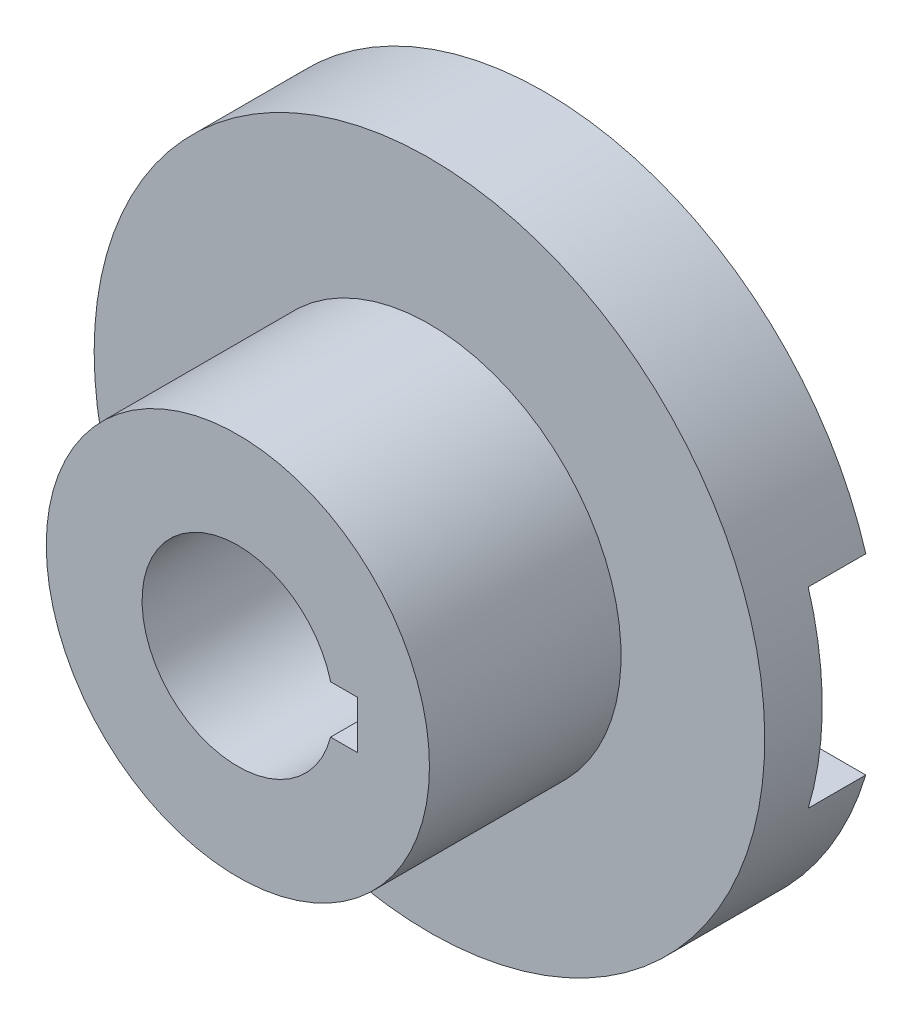
ISO-10303-21;
HEADER;
FILE_DESCRIPTION(('STEP AP214'),'2;1');
FILE_NAME('part.step','',(''),(''),'','','');
FILE_SCHEMA(('AUTOMOTIVE_DESIGN { 1 0 10303 214 1 1 1 1 }'));
ENDSEC;
DATA;
#1=APPLICATION_CONTEXT('core data for automotive mechanical design processes');
#2=APPLICATION_PROTOCOL_DEFINITION('international standard','automotive_design',2000,#1);
#3=PRODUCT_CONTEXT('',#1,'mechanical');
#4=PRODUCT('Part','Part','',(#3));
#5=PRODUCT_RELATED_PRODUCT_CATEGORY('part','',(#4));
#6=PRODUCT_DEFINITION_FORMATION('','',#4);
#7=PRODUCT_DEFINITION_CONTEXT('part definition',#1,'design');
#8=PRODUCT_DEFINITION('design','',#6,#7);
#9=PRODUCT_DEFINITION_SHAPE('','',#8);
#10=(LENGTH_UNIT() NAMED_UNIT(*) SI_UNIT(.MILLI.,.METRE.));
#11=(NAMED_UNIT(*) PLANE_ANGLE_UNIT() SI_UNIT($,.RADIAN.));
#12=(NAMED_UNIT(*) SI_UNIT($,.STERADIAN.) SOLID_ANGLE_UNIT());
#13=UNCERTAINTY_MEASURE_WITH_UNIT(LENGTH_MEASURE(1.E-05),#10,'distance_accuracy_value','');
#14=(GEOMETRIC_REPRESENTATION_CONTEXT(3) GLOBAL_UNCERTAINTY_ASSIGNED_CONTEXT((#13)) GLOBAL_UNIT_ASSIGNED_CONTEXT((#10,
#11,#12)) REPRESENTATION_CONTEXT('',''));
#15=CARTESIAN_POINT('',(0.,0.,0.));
#16=DIRECTION('',(0.,0.,1.));
#17=DIRECTION('',(1.,0.,0.));
#18=AXIS2_PLACEMENT_3D('',#15,#16,#17);
#19=CARTESIAN_POINT('',(0.,0.,5.));
#20=DIRECTION('',(0.,0.,-1.));
#21=DIRECTION('',(-1.,0.,0.));
#22=AXIS2_PLACEMENT_3D('',#19,#20,#21);
#23=CYLINDRICAL_SURFACE('',#22,5.);
#24=CARTESIAN_POINT('',(0.,0.,-8.));
#25=DIRECTION('',(0.,0.,-1.));
#26=DIRECTION('',(-1.,0.,0.));
#27=AXIS2_PLACEMENT_3D('',#24,#25,#26);
#28=CIRCLE('',#27,5.);
#29=CARTESIAN_POINT('',(0.,-5.,-8.));
#30=VERTEX_POINT('',#29);
#31=CARTESIAN_POINT('',(0.,5.,-8.));
#32=VERTEX_POINT('',#31);
#33=EDGE_CURVE('E152',#30,#32,#28,.T.);
#34=ORIENTED_EDGE('',*,*,#33,.T.);
#35=EDGE_CURVE('E162',#32,#30,#28,.T.);
#36=ORIENTED_EDGE('',*,*,#35,.T.);
#37=EDGE_LOOP('',(#34,#36));
#38=FACE_BOUND('',#37,.T.);
#39=CARTESIAN_POINT('',(0.,0.,-5.));
#40=DIRECTION('',(0.,0.,-1.));
#41=DIRECTION('',(-1.,0.,0.));
#42=AXIS2_PLACEMENT_3D('',#39,#40,#41);
#43=CIRCLE('',#42,5.);
#44=CARTESIAN_POINT('',(4.84122918275927,1.25,-5.));
#45=VERTEX_POINT('',#44);
#46=CARTESIAN_POINT('',(4.84122918275927,-1.25,-5.));
#47=VERTEX_POINT('',#46);
#48=EDGE_CURVE('E11',#45,#47,#43,.T.);
#49=ORIENTED_EDGE('',*,*,#48,.F.);
#50=DIRECTION('',(0.,0.,-1.));
#51=VECTOR('',#50,1.);
#52=CARTESIAN_POINT('',(4.84122918275927,1.25,5.));
#53=LINE('',#52,#51);
#54=CARTESIAN_POINT('',(4.84122918275927,1.25,5.));
#55=VERTEX_POINT('',#54);
#56=EDGE_CURVE('E111',#45,#55,#53,.F.);
#57=ORIENTED_EDGE('',*,*,#56,.T.);
#58=CARTESIAN_POINT('',(0.,0.,5.));
#59=DIRECTION('',(0.,0.,1.));
#60=DIRECTION('',(1.,0.,0.));
#61=AXIS2_PLACEMENT_3D('',#58,#59,#60);
#62=CIRCLE('',#61,5.);
#63=CARTESIAN_POINT('',(4.84122918275927,-1.25,5.));
#64=VERTEX_POINT('',#63);
#65=EDGE_CURVE('E173',#55,#64,#62,.T.);
#66=ORIENTED_EDGE('',*,*,#65,.T.);
#67=DIRECTION('',(0.,0.,-1.));
#68=VECTOR('',#67,1.);
#69=CARTESIAN_POINT('',(4.84122918275927,-1.25,5.));
#70=LINE('',#69,#68);
#71=EDGE_CURVE('E48',#47,#64,#70,.F.);
#72=ORIENTED_EDGE('',*,*,#71,.F.);
#73=EDGE_LOOP('',(#49,#57,#66,#72));
#74=FACE_BOUND('',#73,.T.);
#75=ADVANCED_FACE('F33',(#38,#74),#23,.F.);
#76=CARTESIAN_POINT('',(0.,0.,5.));
#77=DIRECTION('',(0.,0.,1.));
#78=DIRECTION('',(1.,0.,0.));
#79=AXIS2_PLACEMENT_3D('',#76,#77,#78);
#80=PLANE('',#79);
#81=CARTESIAN_POINT('',(0.,0.,5.));
#82=DIRECTION('',(0.,0.,1.));
#83=DIRECTION('',(1.,0.,0.));
#84=AXIS2_PLACEMENT_3D('',#81,#82,#83);
#85=CIRCLE('',#84,10.);
#86=CARTESIAN_POINT('',(10.,0.,5.));
#87=VERTEX_POINT('',#86);
#88=EDGE_CURVE('E176',#87,#87,#85,.T.);
#89=ORIENTED_EDGE('',*,*,#88,.T.);
#90=EDGE_LOOP('',(#89));
#91=FACE_BOUND('',#90,.T.);
#92=ORIENTED_EDGE('',*,*,#65,.F.);
#93=DIRECTION('',(1.,0.,0.));
#94=VECTOR('',#93,1.);
#95=CARTESIAN_POINT('',(0.,1.25,5.));
#96=LINE('',#95,#94);
#97=CARTESIAN_POINT('',(6.25,1.25,5.));
#98=VERTEX_POINT('',#97);
#99=EDGE_CURVE('E41',#55,#98,#96,.T.);
#100=ORIENTED_EDGE('',*,*,#99,.T.);
#101=DIRECTION('',(0.,-1.,0.));
#102=VECTOR('',#101,1.);
#103=CARTESIAN_POINT('',(6.25,1.25,5.));
#104=LINE('',#103,#102);
#105=CARTESIAN_POINT('',(6.25,-1.25,5.));
#106=VERTEX_POINT('',#105);
#107=EDGE_CURVE('E115',#98,#106,#104,.T.);
#108=ORIENTED_EDGE('',*,*,#107,.T.);
#109=DIRECTION('',(1.,0.,0.));
#110=VECTOR('',#109,1.);
#111=CARTESIAN_POINT('',(0.,-1.25,5.));
#112=LINE('',#111,#110);
#113=EDGE_CURVE('E179',#64,#106,#112,.T.);
#114=ORIENTED_EDGE('',*,*,#113,.F.);
#115=EDGE_LOOP('',(#92,#100,#108,#114));
#116=FACE_BOUND('',#115,.T.);
#117=ADVANCED_FACE('F182',(#91,#116),#80,.T.);
#118=CARTESIAN_POINT('',(0.,0.,-11.));
#119=DIRECTION('',(0.,0.,-1.));
#120=DIRECTION('',(-1.,0.,0.));
#121=AXIS2_PLACEMENT_3D('',#118,#119,#120);
#122=PLANE('',#121);
#123=DIRECTION('',(1.,0.,0.));
#124=VECTOR('',#123,1.);
#125=CARTESIAN_POINT('',(16.7705098312484,5.,-11.));
#126=LINE('',#125,#124);
#127=CARTESIAN_POINT('',(-16.7705098312484,5.,-11.));
#128=VERTEX_POINT('',#127);
#129=CARTESIAN_POINT('',(16.7705098312484,5.,-11.));
#130=VERTEX_POINT('',#129);
#131=EDGE_CURVE('E138',#128,#130,#126,.T.);
#132=ORIENTED_EDGE('',*,*,#131,.F.);
#133=CARTESIAN_POINT('',(0.,0.,-11.));
#134=DIRECTION('',(0.,0.,-1.));
#135=DIRECTION('',(-1.,0.,0.));
#136=AXIS2_PLACEMENT_3D('',#133,#134,#135);
#137=CIRCLE('',#136,17.5);
#138=EDGE_CURVE('E163',#128,#130,#137,.T.);
#139=ORIENTED_EDGE('',*,*,#138,.T.);
#140=EDGE_LOOP('',(#132,#139));
#141=FACE_BOUND('',#140,.T.);
#142=ADVANCED_FACE('F200',(#141),#122,.T.);
#143=CARTESIAN_POINT('',(0.,0.,5.));
#144=DIRECTION('',(0.,0.,-1.));
#145=DIRECTION('',(-1.,0.,0.));
#146=AXIS2_PLACEMENT_3D('',#143,#144,#145);
#147=CYLINDRICAL_SURFACE('',#146,10.);
#148=ORIENTED_EDGE('',*,*,#88,.F.);
#149=EDGE_LOOP('',(#148));
#150=FACE_BOUND('',#149,.T.);
#151=CARTESIAN_POINT('',(0.,0.,-5.));
#152=DIRECTION('',(0.,0.,-1.));
#153=DIRECTION('',(-1.,0.,0.));
#154=AXIS2_PLACEMENT_3D('',#151,#152,#153);
#155=CIRCLE('',#154,10.);
#156=CARTESIAN_POINT('',(-10.,0.,-5.));
#157=VERTEX_POINT('',#156);
#158=EDGE_CURVE('E166',#157,#157,#155,.T.);
#159=ORIENTED_EDGE('',*,*,#158,.F.);
#160=EDGE_LOOP('',(#159));
#161=FACE_BOUND('',#160,.T.);
#162=ADVANCED_FACE('F35',(#150,#161),#147,.T.);
#163=CARTESIAN_POINT('',(0.,0.,-5.));
#164=DIRECTION('',(0.,0.,-1.));
#165=DIRECTION('',(-1.,0.,0.));
#166=AXIS2_PLACEMENT_3D('',#163,#164,#165);
#167=PLANE('',#166);
#168=CARTESIAN_POINT('',(0.,0.,-5.));
#169=DIRECTION('',(0.,0.,-1.));
#170=DIRECTION('',(-1.,0.,0.));
#171=AXIS2_PLACEMENT_3D('',#168,#169,#170);
#172=CIRCLE('',#171,17.5);
#173=CARTESIAN_POINT('',(-17.5,0.,-5.));
#174=VERTEX_POINT('',#173);
#175=EDGE_CURVE('E168',#174,#174,#172,.T.);
#176=ORIENTED_EDGE('',*,*,#175,.F.);
#177=EDGE_LOOP('',(#176));
#178=FACE_BOUND('',#177,.T.);
#179=ORIENTED_EDGE('',*,*,#158,.T.);
#180=EDGE_LOOP('',(#179));
#181=FACE_BOUND('',#180,.T.);
#182=ADVANCED_FACE('F209',(#178,#181),#167,.F.);
#183=DIRECTION('',(-1.,0.,0.));
#184=VECTOR('',#183,1.);
#185=CARTESIAN_POINT('',(16.7705098312484,-5.,-11.));
#186=LINE('',#185,#184);
#187=CARTESIAN_POINT('',(16.7705098312484,-5.,-11.));
#188=VERTEX_POINT('',#187);
#189=CARTESIAN_POINT('',(-16.7705098312484,-5.00000000000001,-11.));
#190=VERTEX_POINT('',#189);
#191=EDGE_CURVE('E133',#188,#190,#186,.T.);
#192=ORIENTED_EDGE('',*,*,#191,.F.);
#193=EDGE_CURVE('E167',#188,#190,#137,.T.);
#194=ORIENTED_EDGE('',*,*,#193,.T.);
#195=EDGE_LOOP('',(#192,#194));
#196=FACE_BOUND('',#195,.T.);
#197=ADVANCED_FACE('F207',(#196),#122,.T.);
#198=CARTESIAN_POINT('',(0.,0.,-11.));
#199=DIRECTION('',(0.,0.,1.));
#200=DIRECTION('',(1.,0.,0.));
#201=AXIS2_PLACEMENT_3D('',#198,#199,#200);
#202=CYLINDRICAL_SURFACE('',#201,17.5);
#203=CARTESIAN_POINT('',(0.,0.,-8.));
#204=DIRECTION('',(0.,0.,-1.));
#205=DIRECTION('',(-1.,0.,0.));
#206=AXIS2_PLACEMENT_3D('',#203,#204,#205);
#207=CIRCLE('',#206,17.5);
#208=CARTESIAN_POINT('',(16.7705098312484,5.,-8.));
#209=VERTEX_POINT('',#208);
#210=CARTESIAN_POINT('',(16.7705098312484,-5.,-8.));
#211=VERTEX_POINT('',#210);
#212=EDGE_CURVE('E134',#209,#211,#207,.T.);
#213=ORIENTED_EDGE('',*,*,#212,.F.);
#214=DIRECTION('',(0.,0.,-1.));
#215=VECTOR('',#214,1.);
#216=CARTESIAN_POINT('',(16.7705098312484,5.,-8.));
#217=LINE('',#216,#215);
#218=EDGE_CURVE('E149',#209,#130,#217,.T.);
#219=ORIENTED_EDGE('',*,*,#218,.T.);
#220=ORIENTED_EDGE('',*,*,#138,.F.);
#221=DIRECTION('',(0.,0.,-1.));
#222=VECTOR('',#221,1.);
#223=CARTESIAN_POINT('',(-16.7705098312484,5.,-8.));
#224=LINE('',#223,#222);
#225=CARTESIAN_POINT('',(-16.7705098312484,5.,-8.));
#226=VERTEX_POINT('',#225);
#227=EDGE_CURVE('E153',#226,#128,#224,.T.);
#228=ORIENTED_EDGE('',*,*,#227,.F.);
#229=CARTESIAN_POINT('',(0.,0.,-8.));
#230=DIRECTION('',(0.,0.,-1.));
#231=DIRECTION('',(-1.,0.,0.));
#232=AXIS2_PLACEMENT_3D('',#229,#230,#231);
#233=CIRCLE('',#232,17.5);
#234=CARTESIAN_POINT('',(-16.7705098312484,-5.00000000000001,-8.));
#235=VERTEX_POINT('',#234);
#236=EDGE_CURVE('E142',#235,#226,#233,.T.);
#237=ORIENTED_EDGE('',*,*,#236,.F.);
#238=DIRECTION('',(0.,0.,-1.));
#239=VECTOR('',#238,1.);
#240=CARTESIAN_POINT('',(-16.7705098312484,-5.00000000000001,-8.));
#241=LINE('',#240,#239);
#242=EDGE_CURVE('E156',#235,#190,#241,.T.);
#243=ORIENTED_EDGE('',*,*,#242,.T.);
#244=ORIENTED_EDGE('',*,*,#193,.F.);
#245=DIRECTION('',(0.,0.,-1.));
#246=VECTOR('',#245,1.);
#247=CARTESIAN_POINT('',(16.7705098312484,-5.,-8.));
#248=LINE('',#247,#246);
#249=EDGE_CURVE('E146',#211,#188,#248,.T.);
#250=ORIENTED_EDGE('',*,*,#249,.F.);
#251=EDGE_LOOP('',(#213,#219,#220,#228,#237,#243,#244,#250));
#252=FACE_BOUND('',#251,.T.);
#253=ORIENTED_EDGE('',*,*,#175,.T.);
#254=EDGE_LOOP('',(#253));
#255=FACE_BOUND('',#254,.T.);
#256=ADVANCED_FACE('F203',(#252,#255),#202,.T.);
#257=CARTESIAN_POINT('',(16.7705098312484,5.,-8.));
#258=DIRECTION('',(0.,1.,0.));
#259=DIRECTION('',(0.,0.,1.));
#260=AXIS2_PLACEMENT_3D('',#257,#258,#259);
#261=PLANE('',#260);
#262=DIRECTION('',(1.,0.,0.));
#263=VECTOR('',#262,1.);
#264=CARTESIAN_POINT('',(16.7705098312484,5.,-8.));
#265=LINE('',#264,#263);
#266=EDGE_CURVE('E56',#226,#32,#265,.T.);
#267=ORIENTED_EDGE('',*,*,#266,.F.);
#268=ORIENTED_EDGE('',*,*,#227,.T.);
#269=ORIENTED_EDGE('',*,*,#131,.T.);
#270=ORIENTED_EDGE('',*,*,#218,.F.);
#271=EDGE_CURVE('E144',#32,#209,#265,.T.);
#272=ORIENTED_EDGE('',*,*,#271,.F.);
#273=EDGE_LOOP('',(#267,#268,#269,#270,#272));
#274=FACE_BOUND('',#273,.T.);
#275=ADVANCED_FACE('F206',(#274),#261,.F.);
#276=CARTESIAN_POINT('',(16.7705098312484,-5.,-8.));
#277=DIRECTION('',(0.,-1.,0.));
#278=DIRECTION('',(0.,0.,-1.));
#279=AXIS2_PLACEMENT_3D('',#276,#277,#278);
#280=PLANE('',#279);
#281=DIRECTION('',(-1.,0.,0.));
#282=VECTOR('',#281,1.);
#283=CARTESIAN_POINT('',(16.7705098312484,-5.,-8.));
#284=LINE('',#283,#282);
#285=EDGE_CURVE('E139',#211,#30,#284,.T.);
#286=ORIENTED_EDGE('',*,*,#285,.F.);
#287=ORIENTED_EDGE('',*,*,#249,.T.);
#288=ORIENTED_EDGE('',*,*,#191,.T.);
#289=ORIENTED_EDGE('',*,*,#242,.F.);
#290=EDGE_CURVE('E137',#30,#235,#284,.T.);
#291=ORIENTED_EDGE('',*,*,#290,.F.);
#292=EDGE_LOOP('',(#286,#287,#288,#289,#291));
#293=FACE_BOUND('',#292,.T.);
#294=ADVANCED_FACE('F216',(#293),#280,.F.);
#295=CARTESIAN_POINT('',(0.,0.,-8.));
#296=DIRECTION('',(0.,0.,-1.));
#297=DIRECTION('',(-1.,0.,0.));
#298=AXIS2_PLACEMENT_3D('',#295,#296,#297);
#299=PLANE('',#298);
#300=ORIENTED_EDGE('',*,*,#271,.T.);
#301=ORIENTED_EDGE('',*,*,#212,.T.);
#302=ORIENTED_EDGE('',*,*,#285,.T.);
#303=ORIENTED_EDGE('',*,*,#35,.F.);
#304=EDGE_LOOP('',(#300,#301,#302,#303));
#305=FACE_BOUND('',#304,.T.);
#306=ADVANCED_FACE('F219',(#305),#299,.T.);
#307=ORIENTED_EDGE('',*,*,#290,.T.);
#308=ORIENTED_EDGE('',*,*,#236,.T.);
#309=ORIENTED_EDGE('',*,*,#266,.T.);
#310=ORIENTED_EDGE('',*,*,#33,.F.);
#311=EDGE_LOOP('',(#307,#308,#309,#310));
#312=FACE_BOUND('',#311,.T.);
#313=ADVANCED_FACE('F224',(#312),#299,.T.);
#314=CARTESIAN_POINT('',(3.75,1.25,-5.));
#315=DIRECTION('',(0.,-1.,0.));
#316=DIRECTION('',(0.,0.,-1.));
#317=AXIS2_PLACEMENT_3D('',#314,#315,#316);
#318=PLANE('',#317);
#319=DIRECTION('',(1.,0.,0.));
#320=VECTOR('',#319,1.);
#321=CARTESIAN_POINT('',(3.75,1.25,-5.));
#322=LINE('',#321,#320);
#323=CARTESIAN_POINT('',(6.25,1.25,-5.));
#324=VERTEX_POINT('',#323);
#325=EDGE_CURVE('E104',#45,#324,#322,.T.);
#326=ORIENTED_EDGE('',*,*,#325,.T.);
#327=DIRECTION('',(0.,0.,1.));
#328=VECTOR('',#327,1.);
#329=CARTESIAN_POINT('',(6.25,1.25,-5.));
#330=LINE('',#329,#328);
#331=EDGE_CURVE('E108',#324,#98,#330,.T.);
#332=ORIENTED_EDGE('',*,*,#331,.T.);
#333=ORIENTED_EDGE('',*,*,#99,.F.);
#334=ORIENTED_EDGE('',*,*,#56,.F.);
#335=EDGE_LOOP('',(#326,#332,#333,#334));
#336=FACE_BOUND('',#335,.T.);
#337=ADVANCED_FACE('F106',(#336),#318,.T.);
#338=CARTESIAN_POINT('',(6.25,1.25,-5.));
#339=DIRECTION('',(-1.,0.,0.));
#340=DIRECTION('',(0.,0.,1.));
#341=AXIS2_PLACEMENT_3D('',#338,#339,#340);
#342=PLANE('',#341);
#343=ORIENTED_EDGE('',*,*,#107,.F.);
#344=ORIENTED_EDGE('',*,*,#331,.F.);
#345=DIRECTION('',(0.,-1.,0.));
#346=VECTOR('',#345,1.);
#347=CARTESIAN_POINT('',(6.25,1.25,-5.));
#348=LINE('',#347,#346);
#349=CARTESIAN_POINT('',(6.25,-1.25,-5.));
#350=VERTEX_POINT('',#349);
#351=EDGE_CURVE('E114',#324,#350,#348,.T.);
#352=ORIENTED_EDGE('',*,*,#351,.T.);
#353=DIRECTION('',(0.,0.,1.));
#354=VECTOR('',#353,1.);
#355=CARTESIAN_POINT('',(6.25,-1.25,-5.));
#356=LINE('',#355,#354);
#357=EDGE_CURVE('E126',#350,#106,#356,.T.);
#358=ORIENTED_EDGE('',*,*,#357,.T.);
#359=EDGE_LOOP('',(#343,#344,#352,#358));
#360=FACE_BOUND('',#359,.T.);
#361=ADVANCED_FACE('F124',(#360),#342,.T.);
#362=CARTESIAN_POINT('',(3.75,-1.25,-5.));
#363=DIRECTION('',(0.,-1.,0.));
#364=DIRECTION('',(0.,0.,-1.));
#365=AXIS2_PLACEMENT_3D('',#362,#363,#364);
#366=PLANE('',#365);
#367=ORIENTED_EDGE('',*,*,#71,.T.);
#368=ORIENTED_EDGE('',*,*,#113,.T.);
#369=ORIENTED_EDGE('',*,*,#357,.F.);
#370=DIRECTION('',(1.,0.,0.));
#371=VECTOR('',#370,1.);
#372=CARTESIAN_POINT('',(3.75,-1.25,-5.));
#373=LINE('',#372,#371);
#374=EDGE_CURVE('E119',#47,#350,#373,.T.);
#375=ORIENTED_EDGE('',*,*,#374,.F.);
#376=EDGE_LOOP('',(#367,#368,#369,#375));
#377=FACE_BOUND('',#376,.T.);
#378=ADVANCED_FACE('F184',(#377),#366,.F.);
#379=CARTESIAN_POINT('',(0.,0.,-5.));
#380=DIRECTION('',(0.,0.,-1.));
#381=DIRECTION('',(-1.,0.,0.));
#382=AXIS2_PLACEMENT_3D('',#379,#380,#381);
#383=PLANE('',#382);
#384=ORIENTED_EDGE('',*,*,#48,.T.);
#385=ORIENTED_EDGE('',*,*,#374,.T.);
#386=ORIENTED_EDGE('',*,*,#351,.F.);
#387=ORIENTED_EDGE('',*,*,#325,.F.);
#388=EDGE_LOOP('',(#384,#385,#386,#387));
#389=FACE_BOUND('',#388,.T.);
#390=ADVANCED_FACE('F118',(#389),#383,.F.);
#391=CLOSED_SHELL('',(#75,#117,#142,#162,#182,#197,#256,#275,#294,#306,#313,#337,#361,#378,#390));
#392=MANIFOLD_SOLID_BREP('B2',#391);
#393=ADVANCED_BREP_SHAPE_REPRESENTATION('',(#18,#392),#14);
#394=SHAPE_DEFINITION_REPRESENTATION(#9,#393);
ENDSEC;
END-ISO-10303-21;
